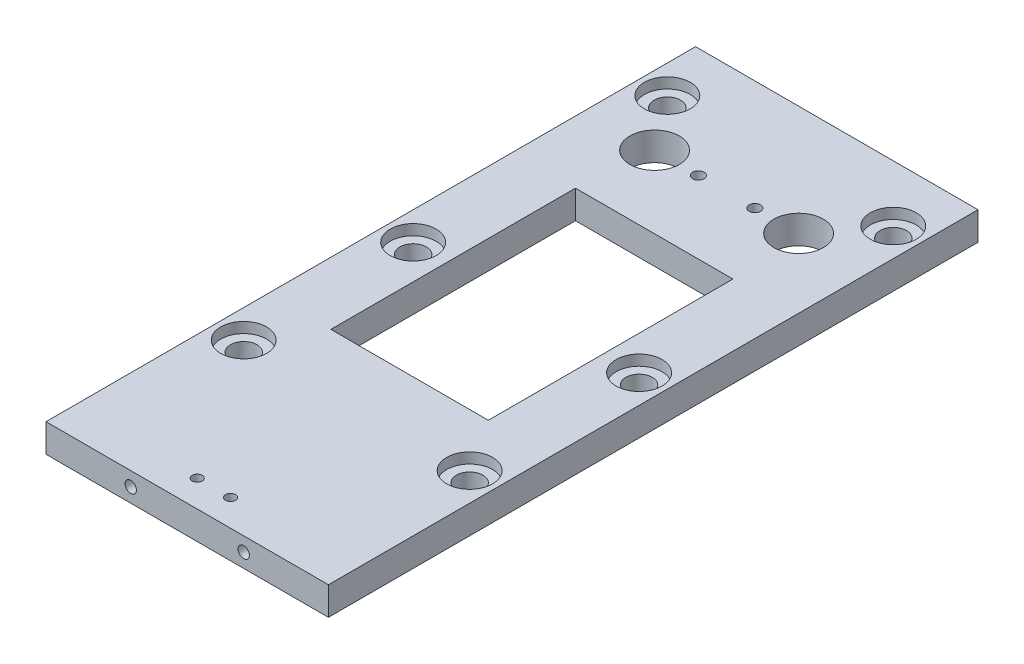
ISO-10303-21;
HEADER;
FILE_DESCRIPTION(('STEP AP214'),'2;1');
FILE_NAME('part.step','',(''),(''),'','','');
FILE_SCHEMA(('AUTOMOTIVE_DESIGN { 1 0 10303 214 1 1 1 1 }'));
ENDSEC;
DATA;
#1=APPLICATION_CONTEXT('core data for automotive mechanical design processes');
#2=APPLICATION_PROTOCOL_DEFINITION('international standard','automotive_design',2000,#1);
#3=PRODUCT_CONTEXT('',#1,'mechanical');
#4=PRODUCT('Part','Part','',(#3));
#5=PRODUCT_RELATED_PRODUCT_CATEGORY('part','',(#4));
#6=PRODUCT_DEFINITION_FORMATION('','',#4);
#7=PRODUCT_DEFINITION_CONTEXT('part definition',#1,'design');
#8=PRODUCT_DEFINITION('design','',#6,#7);
#9=PRODUCT_DEFINITION_SHAPE('','',#8);
#10=(LENGTH_UNIT() NAMED_UNIT(*) SI_UNIT(.MILLI.,.METRE.));
#11=(NAMED_UNIT(*) PLANE_ANGLE_UNIT() SI_UNIT($,.RADIAN.));
#12=(NAMED_UNIT(*) SI_UNIT($,.STERADIAN.) SOLID_ANGLE_UNIT());
#13=UNCERTAINTY_MEASURE_WITH_UNIT(LENGTH_MEASURE(1.E-05),#10,'distance_accuracy_value','');
#14=(GEOMETRIC_REPRESENTATION_CONTEXT(3) GLOBAL_UNCERTAINTY_ASSIGNED_CONTEXT((#13)) GLOBAL_UNIT_ASSIGNED_CONTEXT((#10,
#11,#12)) REPRESENTATION_CONTEXT('',''));
#15=CARTESIAN_POINT('',(0.,0.,0.));
#16=DIRECTION('',(0.,0.,1.));
#17=DIRECTION('',(1.,0.,0.));
#18=AXIS2_PLACEMENT_3D('',#15,#16,#17);
#19=CARTESIAN_POINT('',(0.,12.7,0.));
#20=DIRECTION('',(0.,-1.,0.));
#21=DIRECTION('',(0.,0.,-1.));
#22=AXIS2_PLACEMENT_3D('',#19,#20,#21);
#23=PLANE('',#22);
#24=CARTESIAN_POINT('',(50.8,12.7,3.79999999999998));
#25=DIRECTION('',(0.,1.,0.));
#26=DIRECTION('',(0.,0.,1.));
#27=AXIS2_PLACEMENT_3D('',#24,#25,#26);
#28=CIRCLE('',#27,10.3251);
#29=CARTESIAN_POINT('',(50.8,12.7,14.1251));
#30=VERTEX_POINT('',#29);
#31=EDGE_CURVE('E374',#30,#30,#28,.T.);
#32=ORIENTED_EDGE('',*,*,#31,.F.);
#33=EDGE_LOOP('',(#32));
#34=FACE_BOUND('',#33,.T.);
#35=CARTESIAN_POINT('',(50.8,12.7,-72.4));
#36=DIRECTION('',(0.,1.,0.));
#37=DIRECTION('',(0.,0.,1.));
#38=AXIS2_PLACEMENT_3D('',#35,#36,#37);
#39=CIRCLE('',#38,10.3251);
#40=CARTESIAN_POINT('',(50.8,12.7,-62.0749));
#41=VERTEX_POINT('',#40);
#42=EDGE_CURVE('E406',#41,#41,#39,.T.);
#43=ORIENTED_EDGE('',*,*,#42,.F.);
#44=EDGE_LOOP('',(#43));
#45=FACE_BOUND('',#44,.T.);
#46=CARTESIAN_POINT('',(50.8,12.7,-186.7));
#47=DIRECTION('',(0.,1.,0.));
#48=DIRECTION('',(0.,0.,1.));
#49=AXIS2_PLACEMENT_3D('',#46,#47,#48);
#50=CIRCLE('',#49,10.3251);
#51=CARTESIAN_POINT('',(50.8,12.7,-176.3749));
#52=VERTEX_POINT('',#51);
#53=EDGE_CURVE('E390',#52,#52,#50,.T.);
#54=ORIENTED_EDGE('',*,*,#53,.F.);
#55=EDGE_LOOP('',(#54));
#56=FACE_BOUND('',#55,.T.);
#57=CARTESIAN_POINT('',(-50.8,12.7000000000003,3.80000000000001));
#58=DIRECTION('',(0.,1.,0.));
#59=DIRECTION('',(0.,0.,1.));
#60=AXIS2_PLACEMENT_3D('',#57,#58,#59);
#61=CIRCLE('',#60,10.3251);
#62=CARTESIAN_POINT('',(-50.8,12.7000000000003,14.1251));
#63=VERTEX_POINT('',#62);
#64=EDGE_CURVE('E316',#63,#63,#61,.T.);
#65=ORIENTED_EDGE('',*,*,#64,.F.);
#66=EDGE_LOOP('',(#65));
#67=FACE_BOUND('',#66,.T.);
#68=CARTESIAN_POINT('',(-50.8,12.7000000000003,-72.4));
#69=DIRECTION('',(0.,1.,0.));
#70=DIRECTION('',(0.,0.,1.));
#71=AXIS2_PLACEMENT_3D('',#68,#69,#70);
#72=CIRCLE('',#71,10.3251);
#73=CARTESIAN_POINT('',(-50.8,12.7000000000003,-62.0749));
#74=VERTEX_POINT('',#73);
#75=EDGE_CURVE('E348',#74,#74,#72,.T.);
#76=ORIENTED_EDGE('',*,*,#75,.F.);
#77=EDGE_LOOP('',(#76));
#78=FACE_BOUND('',#77,.T.);
#79=CARTESIAN_POINT('',(-50.8000000000001,12.7000000000003,-186.7));
#80=DIRECTION('',(0.,1.,0.));
#81=DIRECTION('',(0.,0.,1.));
#82=AXIS2_PLACEMENT_3D('',#79,#80,#81);
#83=CIRCLE('',#82,10.3251);
#84=CARTESIAN_POINT('',(-50.8000000000001,12.7000000000003,-176.3749));
#85=VERTEX_POINT('',#84);
#86=EDGE_CURVE('E332',#85,#85,#83,.T.);
#87=ORIENTED_EDGE('',*,*,#86,.F.);
#88=EDGE_LOOP('',(#87));
#89=FACE_BOUND('',#88,.T.);
#90=DIRECTION('',(0.,0.,1.));
#91=VECTOR('',#90,1.);
#92=CARTESIAN_POINT('',(-63.4999999999999,12.7000000000003,80.));
#93=LINE('',#92,#91);
#94=CARTESIAN_POINT('',(-63.5000000000001,12.7000000000003,-212.1));
#95=VERTEX_POINT('',#94);
#96=CARTESIAN_POINT('',(-63.4999999999999,12.7000000000003,80.));
#97=VERTEX_POINT('',#96);
#98=EDGE_CURVE('E364',#95,#97,#93,.T.);
#99=ORIENTED_EDGE('',*,*,#98,.T.);
#100=DIRECTION('',(-1.,0.,0.));
#101=VECTOR('',#100,1.);
#102=CARTESIAN_POINT('',(25.4,12.7,80.));
#103=LINE('',#102,#101);
#104=CARTESIAN_POINT('',(63.5,12.7,80.));
#105=VERTEX_POINT('',#104);
#106=EDGE_CURVE('E165',#105,#97,#103,.T.);
#107=ORIENTED_EDGE('',*,*,#106,.F.);
#108=DIRECTION('',(0.,0.,1.));
#109=VECTOR('',#108,1.);
#110=CARTESIAN_POINT('',(63.5,12.7,80.));
#111=LINE('',#110,#109);
#112=CARTESIAN_POINT('',(63.5,12.7,-212.1));
#113=VERTEX_POINT('',#112);
#114=EDGE_CURVE('E159',#113,#105,#111,.T.);
#115=ORIENTED_EDGE('',*,*,#114,.F.);
#116=DIRECTION('',(1.,0.,0.));
#117=VECTOR('',#116,1.);
#118=CARTESIAN_POINT('',(-63.5000000000001,12.7000000000003,-212.1));
#119=LINE('',#118,#117);
#120=EDGE_CURVE('E137',#95,#113,#119,.T.);
#121=ORIENTED_EDGE('',*,*,#120,.F.);
#122=EDGE_LOOP('',(#99,#107,#115,#121));
#123=FACE_BOUND('',#122,.T.);
#124=DIRECTION('',(1.,0.,0.));
#125=VECTOR('',#124,1.);
#126=CARTESIAN_POINT('',(35.4,12.7,-20.));
#127=LINE('',#126,#125);
#128=CARTESIAN_POINT('',(-35.4,12.7,-20.));
#129=VERTEX_POINT('',#128);
#130=CARTESIAN_POINT('',(35.4,12.7,-20.));
#131=VERTEX_POINT('',#130);
#132=EDGE_CURVE('E258',#129,#131,#127,.T.);
#133=ORIENTED_EDGE('',*,*,#132,.F.);
#134=DIRECTION('',(0.,0.,1.));
#135=VECTOR('',#134,1.);
#136=CARTESIAN_POINT('',(-35.4,12.7,-130.));
#137=LINE('',#136,#135);
#138=CARTESIAN_POINT('',(-35.4,12.7,-130.));
#139=VERTEX_POINT('',#138);
#140=EDGE_CURVE('E262',#139,#129,#137,.T.);
#141=ORIENTED_EDGE('',*,*,#140,.F.);
#142=DIRECTION('',(-1.,0.,0.));
#143=VECTOR('',#142,1.);
#144=CARTESIAN_POINT('',(35.4,12.7,-130.));
#145=LINE('',#144,#143);
#146=CARTESIAN_POINT('',(35.4,12.7,-130.));
#147=VERTEX_POINT('',#146);
#148=EDGE_CURVE('E266',#147,#139,#145,.T.);
#149=ORIENTED_EDGE('',*,*,#148,.F.);
#150=DIRECTION('',(0.,0.,-1.));
#151=VECTOR('',#150,1.);
#152=CARTESIAN_POINT('',(35.4,12.7,-130.));
#153=LINE('',#152,#151);
#154=EDGE_CURVE('E257',#131,#147,#153,.T.);
#155=ORIENTED_EDGE('',*,*,#154,.F.);
#156=EDGE_LOOP('',(#133,#141,#149,#155));
#157=FACE_BOUND('',#156,.T.);
#158=CARTESIAN_POINT('',(-7.49999999999998,12.7000000000001,68.));
#159=DIRECTION('',(0.,-1.,0.));
#160=DIRECTION('',(0.,0.,-1.));
#161=AXIS2_PLACEMENT_3D('',#158,#159,#160);
#162=CIRCLE('',#161,2.25);
#163=CARTESIAN_POINT('',(-7.49999999999998,12.7000000000001,65.75));
#164=VERTEX_POINT('',#163);
#165=EDGE_CURVE('E201',#164,#164,#162,.F.);
#166=ORIENTED_EDGE('',*,*,#165,.F.);
#167=EDGE_LOOP('',(#166));
#168=FACE_BOUND('',#167,.T.);
#169=CARTESIAN_POINT('',(7.50000000000002,12.7000000000001,68.));
#170=DIRECTION('',(0.,-1.,0.));
#171=DIRECTION('',(0.,0.,-1.));
#172=AXIS2_PLACEMENT_3D('',#169,#170,#171);
#173=CIRCLE('',#172,2.25);
#174=CARTESIAN_POINT('',(7.50000000000002,12.7000000000001,65.75));
#175=VERTEX_POINT('',#174);
#176=EDGE_CURVE('E205',#175,#175,#173,.F.);
#177=ORIENTED_EDGE('',*,*,#176,.F.);
#178=EDGE_LOOP('',(#177));
#179=FACE_BOUND('',#178,.T.);
#180=CARTESIAN_POINT('',(32.385,12.7,-162.55));
#181=DIRECTION('',(0.,-1.,0.));
#182=DIRECTION('',(1.,0.,0.));
#183=AXIS2_PLACEMENT_3D('',#180,#181,#182);
#184=CIRCLE('',#183,11.1125);
#185=CARTESIAN_POINT('',(43.4975,12.7,-162.55));
#186=VERTEX_POINT('',#185);
#187=EDGE_CURVE('E72',#186,#186,#184,.F.);
#188=ORIENTED_EDGE('',*,*,#187,.F.);
#189=EDGE_LOOP('',(#188));
#190=FACE_BOUND('',#189,.T.);
#191=CARTESIAN_POINT('',(-32.385,12.7000000000002,-162.55));
#192=DIRECTION('',(0.,-1.,0.));
#193=DIRECTION('',(1.,0.,0.));
#194=AXIS2_PLACEMENT_3D('',#191,#192,#193);
#195=CIRCLE('',#194,11.1125);
#196=CARTESIAN_POINT('',(-21.2725,12.7000000000002,-162.55));
#197=VERTEX_POINT('',#196);
#198=EDGE_CURVE('E13',#197,#197,#195,.F.);
#199=ORIENTED_EDGE('',*,*,#198,.F.);
#200=EDGE_LOOP('',(#199));
#201=FACE_BOUND('',#200,.T.);
#202=CARTESIAN_POINT('',(12.7,12.7,-162.55));
#203=DIRECTION('',(0.,1.,0.));
#204=DIRECTION('',(0.,0.,1.));
#205=AXIS2_PLACEMENT_3D('',#202,#203,#204);
#206=CIRCLE('',#205,2.55269999999996);
#207=CARTESIAN_POINT('',(12.7,12.7,-159.9973));
#208=VERTEX_POINT('',#207);
#209=EDGE_CURVE('E227',#208,#208,#206,.T.);
#210=ORIENTED_EDGE('',*,*,#209,.F.);
#211=EDGE_LOOP('',(#210));
#212=FACE_BOUND('',#211,.T.);
#213=CARTESIAN_POINT('',(-12.7,12.7,-162.55));
#214=DIRECTION('',(0.,1.,0.));
#215=DIRECTION('',(0.,0.,1.));
#216=AXIS2_PLACEMENT_3D('',#213,#214,#215);
#217=CIRCLE('',#216,2.55269999999996);
#218=CARTESIAN_POINT('',(-12.7,12.7,-159.9973));
#219=VERTEX_POINT('',#218);
#220=EDGE_CURVE('E230',#219,#219,#217,.T.);
#221=ORIENTED_EDGE('',*,*,#220,.F.);
#222=EDGE_LOOP('',(#221));
#223=FACE_BOUND('',#222,.T.);
#224=ADVANCED_FACE('F63',(#34,#45,#56,#67,#78,#89,#123,#157,#168,#179,#190,#201,#212,#223),#23,.F.);
#225=CARTESIAN_POINT('',(7.50000000000002,0.,68.));
#226=DIRECTION('',(0.,-1.,0.));
#227=DIRECTION('',(0.,0.,-1.));
#228=AXIS2_PLACEMENT_3D('',#225,#226,#227);
#229=CYLINDRICAL_SURFACE('',#228,4.);
#230=CARTESIAN_POINT('',(7.50000000000002,4.,68.));
#231=DIRECTION('',(0.,-1.,0.));
#232=DIRECTION('',(0.,0.,-1.));
#233=AXIS2_PLACEMENT_3D('',#230,#231,#232);
#234=CIRCLE('',#233,4.);
#235=CARTESIAN_POINT('',(7.50000000000002,4.,64.));
#236=VERTEX_POINT('',#235);
#237=EDGE_CURVE('E190',#236,#236,#234,.T.);
#238=ORIENTED_EDGE('',*,*,#237,.F.);
#239=EDGE_LOOP('',(#238));
#240=FACE_BOUND('',#239,.T.);
#241=CARTESIAN_POINT('',(7.50000000000002,0.,68.));
#242=DIRECTION('',(0.,-1.,0.));
#243=DIRECTION('',(0.,0.,-1.));
#244=AXIS2_PLACEMENT_3D('',#241,#242,#243);
#245=CIRCLE('',#244,4.);
#246=CARTESIAN_POINT('',(7.50000000000002,0.,64.));
#247=VERTEX_POINT('',#246);
#248=EDGE_CURVE('E186',#247,#247,#245,.T.);
#249=ORIENTED_EDGE('',*,*,#248,.T.);
#250=EDGE_LOOP('',(#249));
#251=FACE_BOUND('',#250,.T.);
#252=ADVANCED_FACE('F218',(#240,#251),#229,.F.);
#253=CARTESIAN_POINT('',(9.75000000000002,4.,68.));
#254=DIRECTION('',(0.,1.,0.));
#255=DIRECTION('',(0.,0.,1.));
#256=AXIS2_PLACEMENT_3D('',#253,#254,#255);
#257=PLANE('',#256);
#258=CARTESIAN_POINT('',(7.50000000000002,4.,68.));
#259=DIRECTION('',(0.,-1.,0.));
#260=DIRECTION('',(0.,0.,-1.));
#261=AXIS2_PLACEMENT_3D('',#258,#259,#260);
#262=CIRCLE('',#261,2.25);
#263=CARTESIAN_POINT('',(7.50000000000002,4.,65.75));
#264=VERTEX_POINT('',#263);
#265=EDGE_CURVE('E194',#264,#264,#262,.T.);
#266=ORIENTED_EDGE('',*,*,#265,.F.);
#267=EDGE_LOOP('',(#266));
#268=FACE_BOUND('',#267,.T.);
#269=ORIENTED_EDGE('',*,*,#237,.T.);
#270=EDGE_LOOP('',(#269));
#271=FACE_BOUND('',#270,.T.);
#272=ADVANCED_FACE('F462',(#268,#271),#257,.F.);
#273=CARTESIAN_POINT('',(7.50000000000002,0.,68.));
#274=DIRECTION('',(0.,-1.,0.));
#275=DIRECTION('',(0.,0.,-1.));
#276=AXIS2_PLACEMENT_3D('',#273,#274,#275);
#277=CYLINDRICAL_SURFACE('',#276,2.25);
#278=ORIENTED_EDGE('',*,*,#176,.T.);
#279=EDGE_LOOP('',(#278));
#280=FACE_BOUND('',#279,.T.);
#281=ORIENTED_EDGE('',*,*,#265,.T.);
#282=EDGE_LOOP('',(#281));
#283=FACE_BOUND('',#282,.T.);
#284=ADVANCED_FACE('F458',(#280,#283),#277,.F.);
#285=CARTESIAN_POINT('',(-7.49999999999998,0.,68.));
#286=DIRECTION('',(0.,-1.,0.));
#287=DIRECTION('',(0.,0.,-1.));
#288=AXIS2_PLACEMENT_3D('',#285,#286,#287);
#289=CYLINDRICAL_SURFACE('',#288,4.);
#290=CARTESIAN_POINT('',(-7.49999999999998,4.,68.));
#291=DIRECTION('',(0.,-1.,0.));
#292=DIRECTION('',(0.,0.,-1.));
#293=AXIS2_PLACEMENT_3D('',#290,#291,#292);
#294=CIRCLE('',#293,4.);
#295=CARTESIAN_POINT('',(-7.49999999999998,4.,64.));
#296=VERTEX_POINT('',#295);
#297=EDGE_CURVE('E178',#296,#296,#294,.T.);
#298=ORIENTED_EDGE('',*,*,#297,.F.);
#299=EDGE_LOOP('',(#298));
#300=FACE_BOUND('',#299,.T.);
#301=CARTESIAN_POINT('',(-7.49999999999998,0.,68.));
#302=DIRECTION('',(0.,-1.,0.));
#303=DIRECTION('',(0.,0.,-1.));
#304=AXIS2_PLACEMENT_3D('',#301,#302,#303);
#305=CIRCLE('',#304,4.);
#306=CARTESIAN_POINT('',(-7.49999999999998,0.,64.));
#307=VERTEX_POINT('',#306);
#308=EDGE_CURVE('E174',#307,#307,#305,.T.);
#309=ORIENTED_EDGE('',*,*,#308,.T.);
#310=EDGE_LOOP('',(#309));
#311=FACE_BOUND('',#310,.T.);
#312=ADVANCED_FACE('F461',(#300,#311),#289,.F.);
#313=CARTESIAN_POINT('',(-5.24999999999998,4.,68.));
#314=DIRECTION('',(0.,1.,0.));
#315=DIRECTION('',(0.,0.,1.));
#316=AXIS2_PLACEMENT_3D('',#313,#314,#315);
#317=PLANE('',#316);
#318=CARTESIAN_POINT('',(-7.49999999999998,4.,68.));
#319=DIRECTION('',(0.,-1.,0.));
#320=DIRECTION('',(0.,0.,-1.));
#321=AXIS2_PLACEMENT_3D('',#318,#319,#320);
#322=CIRCLE('',#321,2.25);
#323=CARTESIAN_POINT('',(-7.49999999999998,4.,65.75));
#324=VERTEX_POINT('',#323);
#325=EDGE_CURVE('E182',#324,#324,#322,.T.);
#326=ORIENTED_EDGE('',*,*,#325,.F.);
#327=EDGE_LOOP('',(#326));
#328=FACE_BOUND('',#327,.T.);
#329=ORIENTED_EDGE('',*,*,#297,.T.);
#330=EDGE_LOOP('',(#329));
#331=FACE_BOUND('',#330,.T.);
#332=ADVANCED_FACE('F495',(#328,#331),#317,.F.);
#333=CARTESIAN_POINT('',(-7.49999999999998,0.,68.));
#334=DIRECTION('',(0.,-1.,0.));
#335=DIRECTION('',(0.,0.,-1.));
#336=AXIS2_PLACEMENT_3D('',#333,#334,#335);
#337=CYLINDRICAL_SURFACE('',#336,2.25);
#338=ORIENTED_EDGE('',*,*,#165,.T.);
#339=EDGE_LOOP('',(#338));
#340=FACE_BOUND('',#339,.T.);
#341=ORIENTED_EDGE('',*,*,#325,.T.);
#342=EDGE_LOOP('',(#341));
#343=FACE_BOUND('',#342,.T.);
#344=ADVANCED_FACE('F492',(#340,#343),#337,.F.);
#345=CARTESIAN_POINT('',(50.8,12.7,-72.4));
#346=DIRECTION('',(0.,1.,0.));
#347=DIRECTION('',(0.,0.,1.));
#348=AXIS2_PLACEMENT_3D('',#345,#346,#347);
#349=CYLINDRICAL_SURFACE('',#348,5.953125);
#350=CARTESIAN_POINT('',(50.8,7.9502,-72.4));
#351=DIRECTION('',(0.,1.,0.));
#352=DIRECTION('',(0.,0.,1.));
#353=AXIS2_PLACEMENT_3D('',#350,#351,#352);
#354=CIRCLE('',#353,5.953125);
#355=CARTESIAN_POINT('',(50.8,7.9502,-66.446875));
#356=VERTEX_POINT('',#355);
#357=EDGE_CURVE('E168',#356,#356,#354,.T.);
#358=ORIENTED_EDGE('',*,*,#357,.T.);
#359=EDGE_LOOP('',(#358));
#360=FACE_BOUND('',#359,.T.);
#361=CARTESIAN_POINT('',(50.8,0.,-72.4));
#362=DIRECTION('',(0.,-1.,0.));
#363=DIRECTION('',(0.,0.,-1.));
#364=AXIS2_PLACEMENT_3D('',#361,#362,#363);
#365=CIRCLE('',#364,5.953125);
#366=CARTESIAN_POINT('',(50.8,0.,-78.353125));
#367=VERTEX_POINT('',#366);
#368=EDGE_CURVE('E160',#367,#367,#365,.T.);
#369=ORIENTED_EDGE('',*,*,#368,.T.);
#370=EDGE_LOOP('',(#369));
#371=FACE_BOUND('',#370,.T.);
#372=ADVANCED_FACE('F419',(#360,#371),#349,.F.);
#373=CARTESIAN_POINT('',(50.8,12.7,-186.7));
#374=DIRECTION('',(0.,1.,0.));
#375=DIRECTION('',(0.,0.,1.));
#376=AXIS2_PLACEMENT_3D('',#373,#374,#375);
#377=CYLINDRICAL_SURFACE('',#376,5.953125);
#378=CARTESIAN_POINT('',(50.8,7.9502,-186.7));
#379=DIRECTION('',(0.,1.,0.));
#380=DIRECTION('',(0.,0.,1.));
#381=AXIS2_PLACEMENT_3D('',#378,#379,#380);
#382=CIRCLE('',#381,5.953125);
#383=CARTESIAN_POINT('',(50.8,7.9502,-180.746875));
#384=VERTEX_POINT('',#383);
#385=EDGE_CURVE('E398',#384,#384,#382,.T.);
#386=ORIENTED_EDGE('',*,*,#385,.T.);
#387=EDGE_LOOP('',(#386));
#388=FACE_BOUND('',#387,.T.);
#389=CARTESIAN_POINT('',(50.8,0.,-186.7));
#390=DIRECTION('',(0.,-1.,0.));
#391=DIRECTION('',(0.,0.,-1.));
#392=AXIS2_PLACEMENT_3D('',#389,#390,#391);
#393=CIRCLE('',#392,5.953125);
#394=CARTESIAN_POINT('',(50.8,0.,-192.653125));
#395=VERTEX_POINT('',#394);
#396=EDGE_CURVE('E402',#395,#395,#393,.T.);
#397=ORIENTED_EDGE('',*,*,#396,.T.);
#398=EDGE_LOOP('',(#397));
#399=FACE_BOUND('',#398,.T.);
#400=ADVANCED_FACE('F509',(#388,#399),#377,.F.);
#401=CARTESIAN_POINT('',(50.8,12.7,3.79999999999998));
#402=DIRECTION('',(0.,1.,0.));
#403=DIRECTION('',(0.,0.,1.));
#404=AXIS2_PLACEMENT_3D('',#401,#402,#403);
#405=CYLINDRICAL_SURFACE('',#404,5.953125);
#406=CARTESIAN_POINT('',(50.8,7.9502,3.79999999999998));
#407=DIRECTION('',(0.,1.,0.));
#408=DIRECTION('',(0.,0.,1.));
#409=AXIS2_PLACEMENT_3D('',#406,#407,#408);
#410=CIRCLE('',#409,5.953125);
#411=CARTESIAN_POINT('',(50.8,7.9502,9.75312499999999));
#412=VERTEX_POINT('',#411);
#413=EDGE_CURVE('E382',#412,#412,#410,.T.);
#414=ORIENTED_EDGE('',*,*,#413,.T.);
#415=EDGE_LOOP('',(#414));
#416=FACE_BOUND('',#415,.T.);
#417=CARTESIAN_POINT('',(50.8,0.,3.79999999999998));
#418=DIRECTION('',(0.,-1.,0.));
#419=DIRECTION('',(0.,0.,-1.));
#420=AXIS2_PLACEMENT_3D('',#417,#418,#419);
#421=CIRCLE('',#420,5.953125);
#422=CARTESIAN_POINT('',(50.8,0.,-2.15312500000002));
#423=VERTEX_POINT('',#422);
#424=EDGE_CURVE('E386',#423,#423,#421,.T.);
#425=ORIENTED_EDGE('',*,*,#424,.T.);
#426=EDGE_LOOP('',(#425));
#427=FACE_BOUND('',#426,.T.);
#428=ADVANCED_FACE('F513',(#416,#427),#405,.F.);
#429=CARTESIAN_POINT('',(-50.8,12.7000000000003,-72.4));
#430=DIRECTION('',(0.,1.,0.));
#431=DIRECTION('',(0.,0.,1.));
#432=AXIS2_PLACEMENT_3D('',#429,#430,#431);
#433=CYLINDRICAL_SURFACE('',#432,5.953125);
#434=CARTESIAN_POINT('',(-50.8,7.95020000000025,-72.4));
#435=DIRECTION('',(0.,1.,0.));
#436=DIRECTION('',(0.,0.,1.));
#437=AXIS2_PLACEMENT_3D('',#434,#435,#436);
#438=CIRCLE('',#437,5.953125);
#439=CARTESIAN_POINT('',(-50.8,7.95020000000025,-66.446875));
#440=VERTEX_POINT('',#439);
#441=EDGE_CURVE('E356',#440,#440,#438,.T.);
#442=ORIENTED_EDGE('',*,*,#441,.T.);
#443=EDGE_LOOP('',(#442));
#444=FACE_BOUND('',#443,.T.);
#445=CARTESIAN_POINT('',(-50.8,0.,-72.4));
#446=DIRECTION('',(0.,-1.,0.));
#447=DIRECTION('',(0.,0.,-1.));
#448=AXIS2_PLACEMENT_3D('',#445,#446,#447);
#449=CIRCLE('',#448,5.953125);
#450=CARTESIAN_POINT('',(-50.8,0.,-78.353125));
#451=VERTEX_POINT('',#450);
#452=EDGE_CURVE('E360',#451,#451,#449,.T.);
#453=ORIENTED_EDGE('',*,*,#452,.T.);
#454=EDGE_LOOP('',(#453));
#455=FACE_BOUND('',#454,.T.);
#456=ADVANCED_FACE('F525',(#444,#455),#433,.F.);
#457=CARTESIAN_POINT('',(-50.8000000000001,12.7000000000003,-186.7));
#458=DIRECTION('',(0.,1.,0.));
#459=DIRECTION('',(0.,0.,1.));
#460=AXIS2_PLACEMENT_3D('',#457,#458,#459);
#461=CYLINDRICAL_SURFACE('',#460,5.953125);
#462=CARTESIAN_POINT('',(-50.8000000000001,7.95020000000025,-186.7));
#463=DIRECTION('',(0.,1.,0.));
#464=DIRECTION('',(0.,0.,1.));
#465=AXIS2_PLACEMENT_3D('',#462,#463,#464);
#466=CIRCLE('',#465,5.953125);
#467=CARTESIAN_POINT('',(-50.8000000000001,7.95020000000025,-180.746875));
#468=VERTEX_POINT('',#467);
#469=EDGE_CURVE('E340',#468,#468,#466,.T.);
#470=ORIENTED_EDGE('',*,*,#469,.T.);
#471=EDGE_LOOP('',(#470));
#472=FACE_BOUND('',#471,.T.);
#473=CARTESIAN_POINT('',(-50.8000000000001,0.,-186.7));
#474=DIRECTION('',(0.,-1.,0.));
#475=DIRECTION('',(0.,0.,-1.));
#476=AXIS2_PLACEMENT_3D('',#473,#474,#475);
#477=CIRCLE('',#476,5.953125);
#478=CARTESIAN_POINT('',(-50.8000000000001,0.,-192.653125));
#479=VERTEX_POINT('',#478);
#480=EDGE_CURVE('E344',#479,#479,#477,.T.);
#481=ORIENTED_EDGE('',*,*,#480,.T.);
#482=EDGE_LOOP('',(#481));
#483=FACE_BOUND('',#482,.T.);
#484=ADVANCED_FACE('F537',(#472,#483),#461,.F.);
#485=CARTESIAN_POINT('',(-50.8,12.7000000000003,3.80000000000001));
#486=DIRECTION('',(0.,1.,0.));
#487=DIRECTION('',(0.,0.,1.));
#488=AXIS2_PLACEMENT_3D('',#485,#486,#487);
#489=CYLINDRICAL_SURFACE('',#488,5.953125);
#490=CARTESIAN_POINT('',(-50.8,7.95020000000025,3.80000000000001));
#491=DIRECTION('',(0.,1.,0.));
#492=DIRECTION('',(0.,0.,1.));
#493=AXIS2_PLACEMENT_3D('',#490,#491,#492);
#494=CIRCLE('',#493,5.953125);
#495=CARTESIAN_POINT('',(-50.8,7.95020000000025,9.75312500000001));
#496=VERTEX_POINT('',#495);
#497=EDGE_CURVE('E324',#496,#496,#494,.T.);
#498=ORIENTED_EDGE('',*,*,#497,.T.);
#499=EDGE_LOOP('',(#498));
#500=FACE_BOUND('',#499,.T.);
#501=CARTESIAN_POINT('',(-50.8,0.,3.80000000000001));
#502=DIRECTION('',(0.,-1.,0.));
#503=DIRECTION('',(0.,0.,-1.));
#504=AXIS2_PLACEMENT_3D('',#501,#502,#503);
#505=CIRCLE('',#504,5.953125);
#506=CARTESIAN_POINT('',(-50.8,0.,-2.15312499999999));
#507=VERTEX_POINT('',#506);
#508=EDGE_CURVE('E328',#507,#507,#505,.T.);
#509=ORIENTED_EDGE('',*,*,#508,.T.);
#510=EDGE_LOOP('',(#509));
#511=FACE_BOUND('',#510,.T.);
#512=ADVANCED_FACE('F550',(#500,#511),#489,.F.);
#513=CARTESIAN_POINT('',(-25.4,6.35000000000008,67.3));
#514=DIRECTION('',(0.,0.,1.));
#515=DIRECTION('',(1.,0.,0.));
#516=AXIS2_PLACEMENT_3D('',#513,#514,#515);
#517=CONICAL_SURFACE('',#516,2.5527,1.02974425867665);
#518=CARTESIAN_POINT('',(-25.4,6.35000000000008,65.7661830978083));
#519=VERTEX_POINT('',#518);
#520=VERTEX_LOOP('',#519);
#521=FACE_BOUND('',#520,.T.);
#522=CARTESIAN_POINT('',(-25.4,6.35000000000008,67.3));
#523=DIRECTION('',(0.,0.,1.));
#524=DIRECTION('',(1.,0.,0.));
#525=AXIS2_PLACEMENT_3D('',#522,#523,#524);
#526=CIRCLE('',#525,2.5527);
#527=CARTESIAN_POINT('',(-22.8473,6.35000000000008,67.3));
#528=VERTEX_POINT('',#527);
#529=EDGE_CURVE('E312',#528,#528,#526,.T.);
#530=ORIENTED_EDGE('',*,*,#529,.T.);
#531=EDGE_LOOP('',(#530));
#532=FACE_BOUND('',#531,.T.);
#533=ADVANCED_FACE('F559',(#521,#532),#517,.F.);
#534=CARTESIAN_POINT('',(25.4,6.34999999999996,67.3));
#535=DIRECTION('',(0.,0.,1.));
#536=DIRECTION('',(1.,0.,0.));
#537=AXIS2_PLACEMENT_3D('',#534,#535,#536);
#538=CONICAL_SURFACE('',#537,2.5527,1.02974425867665);
#539=CARTESIAN_POINT('',(25.4,6.34999999999996,65.7661830978083));
#540=VERTEX_POINT('',#539);
#541=VERTEX_LOOP('',#540);
#542=FACE_BOUND('',#541,.T.);
#543=CARTESIAN_POINT('',(25.4,6.34999999999996,67.3));
#544=DIRECTION('',(0.,0.,1.));
#545=DIRECTION('',(1.,0.,0.));
#546=AXIS2_PLACEMENT_3D('',#543,#544,#545);
#547=CIRCLE('',#546,2.5527);
#548=CARTESIAN_POINT('',(27.9527,6.34999999999996,67.3));
#549=VERTEX_POINT('',#548);
#550=EDGE_CURVE('E304',#549,#549,#547,.T.);
#551=ORIENTED_EDGE('',*,*,#550,.T.);
#552=EDGE_LOOP('',(#551));
#553=FACE_BOUND('',#552,.T.);
#554=ADVANCED_FACE('F541',(#542,#553),#538,.F.);
#555=CARTESIAN_POINT('',(-44.846875,7.95020000000025,-72.4));
#556=DIRECTION('',(0.,-1.,0.));
#557=DIRECTION('',(0.,0.,-1.));
#558=AXIS2_PLACEMENT_3D('',#555,#556,#557);
#559=PLANE('',#558);
#560=ORIENTED_EDGE('',*,*,#441,.F.);
#561=EDGE_LOOP('',(#560));
#562=FACE_BOUND('',#561,.T.);
#563=CARTESIAN_POINT('',(-50.8,7.95020000000025,-72.4));
#564=DIRECTION('',(0.,1.,0.));
#565=DIRECTION('',(0.,0.,1.));
#566=AXIS2_PLACEMENT_3D('',#563,#564,#565);
#567=CIRCLE('',#566,10.3251);
#568=CARTESIAN_POINT('',(-50.8,7.95020000000025,-62.0749));
#569=VERTEX_POINT('',#568);
#570=EDGE_CURVE('E352',#569,#569,#567,.T.);
#571=ORIENTED_EDGE('',*,*,#570,.T.);
#572=EDGE_LOOP('',(#571));
#573=FACE_BOUND('',#572,.T.);
#574=ADVANCED_FACE('F426',(#562,#573),#559,.F.);
#575=CARTESIAN_POINT('',(56.753125,7.9502,-72.4));
#576=DIRECTION('',(0.,-1.,0.));
#577=DIRECTION('',(0.,0.,-1.));
#578=AXIS2_PLACEMENT_3D('',#575,#576,#577);
#579=PLANE('',#578);
#580=ORIENTED_EDGE('',*,*,#357,.F.);
#581=EDGE_LOOP('',(#580));
#582=FACE_BOUND('',#581,.T.);
#583=CARTESIAN_POINT('',(50.8,7.9502,-72.4));
#584=DIRECTION('',(0.,1.,0.));
#585=DIRECTION('',(0.,0.,1.));
#586=AXIS2_PLACEMENT_3D('',#583,#584,#585);
#587=CIRCLE('',#586,10.3251);
#588=CARTESIAN_POINT('',(50.8,7.9502,-62.0749));
#589=VERTEX_POINT('',#588);
#590=EDGE_CURVE('E410',#589,#589,#587,.T.);
#591=ORIENTED_EDGE('',*,*,#590,.T.);
#592=EDGE_LOOP('',(#591));
#593=FACE_BOUND('',#592,.T.);
#594=ADVANCED_FACE('F422',(#582,#593),#579,.F.);
#595=CARTESIAN_POINT('',(56.753125,7.9502,-186.7));
#596=DIRECTION('',(0.,-1.,0.));
#597=DIRECTION('',(0.,0.,-1.));
#598=AXIS2_PLACEMENT_3D('',#595,#596,#597);
#599=PLANE('',#598);
#600=ORIENTED_EDGE('',*,*,#385,.F.);
#601=EDGE_LOOP('',(#600));
#602=FACE_BOUND('',#601,.T.);
#603=CARTESIAN_POINT('',(50.8,7.9502,-186.7));
#604=DIRECTION('',(0.,1.,0.));
#605=DIRECTION('',(0.,0.,1.));
#606=AXIS2_PLACEMENT_3D('',#603,#604,#605);
#607=CIRCLE('',#606,10.3251);
#608=CARTESIAN_POINT('',(50.8,7.9502,-176.3749));
#609=VERTEX_POINT('',#608);
#610=EDGE_CURVE('E394',#609,#609,#607,.T.);
#611=ORIENTED_EDGE('',*,*,#610,.T.);
#612=EDGE_LOOP('',(#611));
#613=FACE_BOUND('',#612,.T.);
#614=ADVANCED_FACE('F425',(#602,#613),#599,.F.);
#615=CARTESIAN_POINT('',(-44.8468750000001,7.95020000000025,-186.7));
#616=DIRECTION('',(0.,-1.,0.));
#617=DIRECTION('',(0.,0.,-1.));
#618=AXIS2_PLACEMENT_3D('',#615,#616,#617);
#619=PLANE('',#618);
#620=ORIENTED_EDGE('',*,*,#469,.F.);
#621=EDGE_LOOP('',(#620));
#622=FACE_BOUND('',#621,.T.);
#623=CARTESIAN_POINT('',(-50.8000000000001,7.95020000000025,-186.7));
#624=DIRECTION('',(0.,1.,0.));
#625=DIRECTION('',(0.,0.,1.));
#626=AXIS2_PLACEMENT_3D('',#623,#624,#625);
#627=CIRCLE('',#626,10.3251);
#628=CARTESIAN_POINT('',(-50.8000000000001,7.95020000000025,-176.3749));
#629=VERTEX_POINT('',#628);
#630=EDGE_CURVE('E336',#629,#629,#627,.T.);
#631=ORIENTED_EDGE('',*,*,#630,.T.);
#632=EDGE_LOOP('',(#631));
#633=FACE_BOUND('',#632,.T.);
#634=ADVANCED_FACE('F517',(#622,#633),#619,.F.);
#635=CARTESIAN_POINT('',(56.753125,7.9502,3.79999999999998));
#636=DIRECTION('',(0.,-1.,0.));
#637=DIRECTION('',(0.,0.,-1.));
#638=AXIS2_PLACEMENT_3D('',#635,#636,#637);
#639=PLANE('',#638);
#640=ORIENTED_EDGE('',*,*,#413,.F.);
#641=EDGE_LOOP('',(#640));
#642=FACE_BOUND('',#641,.T.);
#643=CARTESIAN_POINT('',(50.8,7.9502,3.79999999999998));
#644=DIRECTION('',(0.,1.,0.));
#645=DIRECTION('',(0.,0.,1.));
#646=AXIS2_PLACEMENT_3D('',#643,#644,#645);
#647=CIRCLE('',#646,10.3251);
#648=CARTESIAN_POINT('',(50.8,7.9502,14.1251));
#649=VERTEX_POINT('',#648);
#650=EDGE_CURVE('E378',#649,#649,#647,.T.);
#651=ORIENTED_EDGE('',*,*,#650,.T.);
#652=EDGE_LOOP('',(#651));
#653=FACE_BOUND('',#652,.T.);
#654=ADVANCED_FACE('F527',(#642,#653),#639,.F.);
#655=CARTESIAN_POINT('',(-44.846875,7.95020000000025,3.80000000000001));
#656=DIRECTION('',(0.,-1.,0.));
#657=DIRECTION('',(0.,0.,-1.));
#658=AXIS2_PLACEMENT_3D('',#655,#656,#657);
#659=PLANE('',#658);
#660=ORIENTED_EDGE('',*,*,#497,.F.);
#661=EDGE_LOOP('',(#660));
#662=FACE_BOUND('',#661,.T.);
#663=CARTESIAN_POINT('',(-50.8,7.95020000000025,3.80000000000001));
#664=DIRECTION('',(0.,1.,0.));
#665=DIRECTION('',(0.,0.,1.));
#666=AXIS2_PLACEMENT_3D('',#663,#664,#665);
#667=CIRCLE('',#666,10.3251);
#668=CARTESIAN_POINT('',(-50.8,7.95020000000025,14.1251));
#669=VERTEX_POINT('',#668);
#670=EDGE_CURVE('E320',#669,#669,#667,.T.);
#671=ORIENTED_EDGE('',*,*,#670,.T.);
#672=EDGE_LOOP('',(#671));
#673=FACE_BOUND('',#672,.T.);
#674=ADVANCED_FACE('F530',(#662,#673),#659,.F.);
#675=CARTESIAN_POINT('',(50.8,12.7,3.79999999999998));
#676=DIRECTION('',(0.,1.,0.));
#677=DIRECTION('',(0.,0.,1.));
#678=AXIS2_PLACEMENT_3D('',#675,#676,#677);
#679=CYLINDRICAL_SURFACE('',#678,10.3251);
#680=ORIENTED_EDGE('',*,*,#650,.F.);
#681=EDGE_LOOP('',(#680));
#682=FACE_BOUND('',#681,.T.);
#683=ORIENTED_EDGE('',*,*,#31,.T.);
#684=EDGE_LOOP('',(#683));
#685=FACE_BOUND('',#684,.T.);
#686=ADVANCED_FACE('F434',(#682,#685),#679,.F.);
#687=CARTESIAN_POINT('',(50.8,12.7,-72.4));
#688=DIRECTION('',(0.,1.,0.));
#689=DIRECTION('',(0.,0.,1.));
#690=AXIS2_PLACEMENT_3D('',#687,#688,#689);
#691=CYLINDRICAL_SURFACE('',#690,10.3251);
#692=ORIENTED_EDGE('',*,*,#590,.F.);
#693=EDGE_LOOP('',(#692));
#694=FACE_BOUND('',#693,.T.);
#695=ORIENTED_EDGE('',*,*,#42,.T.);
#696=EDGE_LOOP('',(#695));
#697=FACE_BOUND('',#696,.T.);
#698=ADVANCED_FACE('F430',(#694,#697),#691,.F.);
#699=CARTESIAN_POINT('',(50.8,12.7,-186.7));
#700=DIRECTION('',(0.,1.,0.));
#701=DIRECTION('',(0.,0.,1.));
#702=AXIS2_PLACEMENT_3D('',#699,#700,#701);
#703=CYLINDRICAL_SURFACE('',#702,10.3251);
#704=ORIENTED_EDGE('',*,*,#610,.F.);
#705=EDGE_LOOP('',(#704));
#706=FACE_BOUND('',#705,.T.);
#707=ORIENTED_EDGE('',*,*,#53,.T.);
#708=EDGE_LOOP('',(#707));
#709=FACE_BOUND('',#708,.T.);
#710=ADVANCED_FACE('F433',(#706,#709),#703,.F.);
#711=CARTESIAN_POINT('',(-50.8000000000001,12.7000000000003,-186.7));
#712=DIRECTION('',(0.,1.,0.));
#713=DIRECTION('',(0.,0.,1.));
#714=AXIS2_PLACEMENT_3D('',#711,#712,#713);
#715=CYLINDRICAL_SURFACE('',#714,10.3251);
#716=ORIENTED_EDGE('',*,*,#630,.F.);
#717=EDGE_LOOP('',(#716));
#718=FACE_BOUND('',#717,.T.);
#719=ORIENTED_EDGE('',*,*,#86,.T.);
#720=EDGE_LOOP('',(#719));
#721=FACE_BOUND('',#720,.T.);
#722=ADVANCED_FACE('F521',(#718,#721),#715,.F.);
#723=CARTESIAN_POINT('',(-50.8,12.7000000000003,-72.4));
#724=DIRECTION('',(0.,1.,0.));
#725=DIRECTION('',(0.,0.,1.));
#726=AXIS2_PLACEMENT_3D('',#723,#724,#725);
#727=CYLINDRICAL_SURFACE('',#726,10.3251);
#728=ORIENTED_EDGE('',*,*,#570,.F.);
#729=EDGE_LOOP('',(#728));
#730=FACE_BOUND('',#729,.T.);
#731=ORIENTED_EDGE('',*,*,#75,.T.);
#732=EDGE_LOOP('',(#731));
#733=FACE_BOUND('',#732,.T.);
#734=ADVANCED_FACE('F543',(#730,#733),#727,.F.);
#735=CARTESIAN_POINT('',(-50.8,12.7000000000003,3.80000000000001));
#736=DIRECTION('',(0.,1.,0.));
#737=DIRECTION('',(0.,0.,1.));
#738=AXIS2_PLACEMENT_3D('',#735,#736,#737);
#739=CYLINDRICAL_SURFACE('',#738,10.3251);
#740=ORIENTED_EDGE('',*,*,#670,.F.);
#741=EDGE_LOOP('',(#740));
#742=FACE_BOUND('',#741,.T.);
#743=ORIENTED_EDGE('',*,*,#64,.T.);
#744=EDGE_LOOP('',(#743));
#745=FACE_BOUND('',#744,.T.);
#746=ADVANCED_FACE('F546',(#742,#745),#739,.F.);
#747=CARTESIAN_POINT('',(35.4,-130.815289626251,-130.));
#748=DIRECTION('',(0.,0.,-1.));
#749=DIRECTION('',(-1.,0.,0.));
#750=AXIS2_PLACEMENT_3D('',#747,#748,#749);
#751=PLANE('',#750);
#752=DIRECTION('',(0.,1.,0.));
#753=VECTOR('',#752,1.);
#754=CARTESIAN_POINT('',(35.4,-130.815289626251,-130.));
#755=LINE('',#754,#753);
#756=CARTESIAN_POINT('',(35.4,0.,-130.));
#757=VERTEX_POINT('',#756);
#758=EDGE_CURVE('E88',#757,#147,#755,.T.);
#759=ORIENTED_EDGE('',*,*,#758,.T.);
#760=ORIENTED_EDGE('',*,*,#148,.T.);
#761=DIRECTION('',(0.,1.,0.));
#762=VECTOR('',#761,1.);
#763=CARTESIAN_POINT('',(-35.4,-130.815289626251,-130.));
#764=LINE('',#763,#762);
#765=CARTESIAN_POINT('',(-35.4,0.,-130.));
#766=VERTEX_POINT('',#765);
#767=EDGE_CURVE('E275',#766,#139,#764,.T.);
#768=ORIENTED_EDGE('',*,*,#767,.F.);
#769=DIRECTION('',(-1.,0.,0.));
#770=VECTOR('',#769,1.);
#771=CARTESIAN_POINT('',(35.4,0.,-130.));
#772=LINE('',#771,#770);
#773=EDGE_CURVE('E261',#757,#766,#772,.T.);
#774=ORIENTED_EDGE('',*,*,#773,.F.);
#775=EDGE_LOOP('',(#759,#760,#768,#774));
#776=FACE_BOUND('',#775,.T.);
#777=ADVANCED_FACE('F487',(#776),#751,.F.);
#778=CARTESIAN_POINT('',(63.5,12.7,80.));
#779=DIRECTION('',(1.,0.,0.));
#780=DIRECTION('',(0.,0.,-1.));
#781=AXIS2_PLACEMENT_3D('',#778,#779,#780);
#782=PLANE('',#781);
#783=DIRECTION('',(0.,0.,1.));
#784=VECTOR('',#783,1.);
#785=CARTESIAN_POINT('',(63.5,0.,80.));
#786=LINE('',#785,#784);
#787=CARTESIAN_POINT('',(63.5,0.,-212.1));
#788=VERTEX_POINT('',#787);
#789=CARTESIAN_POINT('',(63.5,0.,80.));
#790=VERTEX_POINT('',#789);
#791=EDGE_CURVE('E148',#788,#790,#786,.T.);
#792=ORIENTED_EDGE('',*,*,#791,.F.);
#793=DIRECTION('',(0.,-1.,0.));
#794=VECTOR('',#793,1.);
#795=CARTESIAN_POINT('',(63.5,12.7,-212.1));
#796=LINE('',#795,#794);
#797=EDGE_CURVE('E134',#113,#788,#796,.T.);
#798=ORIENTED_EDGE('',*,*,#797,.F.);
#799=ORIENTED_EDGE('',*,*,#114,.T.);
#800=DIRECTION('',(0.,-1.,0.));
#801=VECTOR('',#800,1.);
#802=CARTESIAN_POINT('',(63.5,12.7,80.));
#803=LINE('',#802,#801);
#804=EDGE_CURVE('E157',#105,#790,#803,.T.);
#805=ORIENTED_EDGE('',*,*,#804,.T.);
#806=EDGE_LOOP('',(#792,#798,#799,#805));
#807=FACE_BOUND('',#806,.T.);
#808=ADVANCED_FACE('F155',(#807),#782,.T.);
#809=CARTESIAN_POINT('',(0.,0.,0.));
#810=DIRECTION('',(0.,-1.,0.));
#811=DIRECTION('',(0.,0.,-1.));
#812=AXIS2_PLACEMENT_3D('',#809,#810,#811);
#813=PLANE('',#812);
#814=CARTESIAN_POINT('',(-12.7,0.,-162.55));
#815=DIRECTION('',(0.,-1.,0.));
#816=DIRECTION('',(0.,0.,-1.));
#817=AXIS2_PLACEMENT_3D('',#814,#815,#816);
#818=CIRCLE('',#817,2.55269999999998);
#819=CARTESIAN_POINT('',(-12.7,0.,-165.1027));
#820=VERTEX_POINT('',#819);
#821=EDGE_CURVE('E233',#820,#820,#818,.T.);
#822=ORIENTED_EDGE('',*,*,#821,.F.);
#823=EDGE_LOOP('',(#822));
#824=FACE_BOUND('',#823,.T.);
#825=CARTESIAN_POINT('',(12.7,0.,-162.55));
#826=DIRECTION('',(0.,-1.,0.));
#827=DIRECTION('',(0.,0.,-1.));
#828=AXIS2_PLACEMENT_3D('',#825,#826,#827);
#829=CIRCLE('',#828,2.55269999999998);
#830=CARTESIAN_POINT('',(12.7,0.,-165.1027));
#831=VERTEX_POINT('',#830);
#832=EDGE_CURVE('E142',#831,#831,#829,.T.);
#833=ORIENTED_EDGE('',*,*,#832,.F.);
#834=EDGE_LOOP('',(#833));
#835=FACE_BOUND('',#834,.T.);
#836=CARTESIAN_POINT('',(32.385,0.,-162.55));
#837=DIRECTION('',(0.,-1.,0.));
#838=DIRECTION('',(0.,0.,-1.));
#839=AXIS2_PLACEMENT_3D('',#836,#837,#838);
#840=CIRCLE('',#839,11.1125);
#841=CARTESIAN_POINT('',(32.385,0.,-173.6625));
#842=VERTEX_POINT('',#841);
#843=EDGE_CURVE('E249',#842,#842,#840,.T.);
#844=ORIENTED_EDGE('',*,*,#843,.F.);
#845=EDGE_LOOP('',(#844));
#846=FACE_BOUND('',#845,.T.);
#847=CARTESIAN_POINT('',(-32.385,0.,-162.55));
#848=DIRECTION('',(0.,-1.,0.));
#849=DIRECTION('',(0.,0.,-1.));
#850=AXIS2_PLACEMENT_3D('',#847,#848,#849);
#851=CIRCLE('',#850,11.1125);
#852=CARTESIAN_POINT('',(-32.385,0.,-173.6625));
#853=VERTEX_POINT('',#852);
#854=EDGE_CURVE('E253',#853,#853,#851,.T.);
#855=ORIENTED_EDGE('',*,*,#854,.F.);
#856=EDGE_LOOP('',(#855));
#857=FACE_BOUND('',#856,.T.);
#858=ORIENTED_EDGE('',*,*,#773,.T.);
#859=DIRECTION('',(0.,0.,1.));
#860=VECTOR('',#859,1.);
#861=CARTESIAN_POINT('',(-35.4,0.,-130.));
#862=LINE('',#861,#860);
#863=CARTESIAN_POINT('',(-35.4,0.,-20.));
#864=VERTEX_POINT('',#863);
#865=EDGE_CURVE('E286',#766,#864,#862,.T.);
#866=ORIENTED_EDGE('',*,*,#865,.T.);
#867=DIRECTION('',(1.,0.,0.));
#868=VECTOR('',#867,1.);
#869=CARTESIAN_POINT('',(35.4,0.,-20.));
#870=LINE('',#869,#868);
#871=CARTESIAN_POINT('',(35.4,0.,-20.));
#872=VERTEX_POINT('',#871);
#873=EDGE_CURVE('E281',#864,#872,#870,.T.);
#874=ORIENTED_EDGE('',*,*,#873,.T.);
#875=DIRECTION('',(0.,0.,-1.));
#876=VECTOR('',#875,1.);
#877=CARTESIAN_POINT('',(35.4,0.,-130.));
#878=LINE('',#877,#876);
#879=EDGE_CURVE('E276',#872,#757,#878,.T.);
#880=ORIENTED_EDGE('',*,*,#879,.T.);
#881=EDGE_LOOP('',(#858,#866,#874,#880));
#882=FACE_BOUND('',#881,.T.);
#883=ORIENTED_EDGE('',*,*,#508,.F.);
#884=EDGE_LOOP('',(#883));
#885=FACE_BOUND('',#884,.T.);
#886=ORIENTED_EDGE('',*,*,#480,.F.);
#887=EDGE_LOOP('',(#886));
#888=FACE_BOUND('',#887,.T.);
#889=ORIENTED_EDGE('',*,*,#452,.F.);
#890=EDGE_LOOP('',(#889));
#891=FACE_BOUND('',#890,.T.);
#892=ORIENTED_EDGE('',*,*,#424,.F.);
#893=EDGE_LOOP('',(#892));
#894=FACE_BOUND('',#893,.T.);
#895=ORIENTED_EDGE('',*,*,#396,.F.);
#896=EDGE_LOOP('',(#895));
#897=FACE_BOUND('',#896,.T.);
#898=ORIENTED_EDGE('',*,*,#368,.F.);
#899=EDGE_LOOP('',(#898));
#900=FACE_BOUND('',#899,.T.);
#901=ORIENTED_EDGE('',*,*,#308,.F.);
#902=EDGE_LOOP('',(#901));
#903=FACE_BOUND('',#902,.T.);
#904=ORIENTED_EDGE('',*,*,#248,.F.);
#905=EDGE_LOOP('',(#904));
#906=FACE_BOUND('',#905,.T.);
#907=DIRECTION('',(0.,0.,1.));
#908=VECTOR('',#907,1.);
#909=CARTESIAN_POINT('',(-63.5,3.13543990575725E-13,80.));
#910=LINE('',#909,#908);
#911=CARTESIAN_POINT('',(-63.5000000000001,3.13543990575726E-13,-212.1));
#912=VERTEX_POINT('',#911);
#913=CARTESIAN_POINT('',(-63.5,3.13543990575725E-13,80.));
#914=VERTEX_POINT('',#913);
#915=EDGE_CURVE('E150',#912,#914,#910,.T.);
#916=ORIENTED_EDGE('',*,*,#915,.F.);
#917=DIRECTION('',(-1.,0.,0.));
#918=VECTOR('',#917,1.);
#919=CARTESIAN_POINT('',(63.5,0.,-212.1));
#920=LINE('',#919,#918);
#921=EDGE_CURVE('E80',#788,#912,#920,.T.);
#922=ORIENTED_EDGE('',*,*,#921,.F.);
#923=ORIENTED_EDGE('',*,*,#791,.T.);
#924=DIRECTION('',(1.,0.,0.));
#925=VECTOR('',#924,1.);
#926=CARTESIAN_POINT('',(-25.4,0.,80.));
#927=LINE('',#926,#925);
#928=EDGE_CURVE('E198',#914,#790,#927,.T.);
#929=ORIENTED_EDGE('',*,*,#928,.F.);
#930=EDGE_LOOP('',(#916,#922,#923,#929));
#931=FACE_BOUND('',#930,.T.);
#932=ADVANCED_FACE('F146',(#824,#835,#846,#857,#882,#885,#888,#891,#894,#897,#900,#903,#906,
#931),#813,.T.);
#933=CARTESIAN_POINT('',(-63.4999999999999,12.7000000000003,80.));
#934=DIRECTION('',(1.,0.,0.));
#935=DIRECTION('',(0.,1.,0.));
#936=AXIS2_PLACEMENT_3D('',#933,#934,#935);
#937=PLANE('',#936);
#938=DIRECTION('',(0.,1.,0.));
#939=VECTOR('',#938,1.);
#940=CARTESIAN_POINT('',(-63.5000000000001,3.13543990575726E-13,-212.1));
#941=LINE('',#940,#939);
#942=EDGE_CURVE('E152',#912,#95,#941,.T.);
#943=ORIENTED_EDGE('',*,*,#942,.F.);
#944=ORIENTED_EDGE('',*,*,#915,.T.);
#945=DIRECTION('',(0.,-1.,0.));
#946=VECTOR('',#945,1.);
#947=CARTESIAN_POINT('',(-63.4999999999999,12.7000000000003,80.));
#948=LINE('',#947,#946);
#949=EDGE_CURVE('E368',#97,#914,#948,.T.);
#950=ORIENTED_EDGE('',*,*,#949,.F.);
#951=ORIENTED_EDGE('',*,*,#98,.F.);
#952=EDGE_LOOP('',(#943,#944,#950,#951));
#953=FACE_BOUND('',#952,.T.);
#954=ADVANCED_FACE('F478',(#953),#937,.F.);
#955=CARTESIAN_POINT('',(-25.4,6.35000000000008,80.));
#956=DIRECTION('',(0.,0.,1.));
#957=DIRECTION('',(1.,0.,0.));
#958=AXIS2_PLACEMENT_3D('',#955,#956,#957);
#959=CYLINDRICAL_SURFACE('',#958,2.55269999999999);
#960=ORIENTED_EDGE('',*,*,#529,.F.);
#961=EDGE_LOOP('',(#960));
#962=FACE_BOUND('',#961,.T.);
#963=CARTESIAN_POINT('',(-25.4,6.35000000000008,80.));
#964=DIRECTION('',(0.,0.,1.));
#965=DIRECTION('',(1.,0.,0.));
#966=AXIS2_PLACEMENT_3D('',#963,#964,#965);
#967=CIRCLE('',#966,2.55269999999999);
#968=CARTESIAN_POINT('',(-22.8473,6.35000000000008,80.));
#969=VERTEX_POINT('',#968);
#970=EDGE_CURVE('E308',#969,#969,#967,.T.);
#971=ORIENTED_EDGE('',*,*,#970,.T.);
#972=EDGE_LOOP('',(#971));
#973=FACE_BOUND('',#972,.T.);
#974=ADVANCED_FACE('F483',(#962,#973),#959,.F.);
#975=CARTESIAN_POINT('',(25.4,6.34999999999996,80.));
#976=DIRECTION('',(0.,0.,1.));
#977=DIRECTION('',(1.,0.,0.));
#978=AXIS2_PLACEMENT_3D('',#975,#976,#977);
#979=CYLINDRICAL_SURFACE('',#978,2.55269999999999);
#980=ORIENTED_EDGE('',*,*,#550,.F.);
#981=EDGE_LOOP('',(#980));
#982=FACE_BOUND('',#981,.T.);
#983=CARTESIAN_POINT('',(25.4,6.34999999999996,80.));
#984=DIRECTION('',(0.,0.,1.));
#985=DIRECTION('',(1.,0.,0.));
#986=AXIS2_PLACEMENT_3D('',#983,#984,#985);
#987=CIRCLE('',#986,2.55269999999999);
#988=CARTESIAN_POINT('',(27.9527,6.34999999999996,80.));
#989=VERTEX_POINT('',#988);
#990=EDGE_CURVE('E300',#989,#989,#987,.T.);
#991=ORIENTED_EDGE('',*,*,#990,.T.);
#992=EDGE_LOOP('',(#991));
#993=FACE_BOUND('',#992,.T.);
#994=ADVANCED_FACE('F572',(#982,#993),#979,.F.);
#995=CARTESIAN_POINT('',(-25.4,30.,80.));
#996=DIRECTION('',(0.,0.,-1.));
#997=DIRECTION('',(-1.,0.,0.));
#998=AXIS2_PLACEMENT_3D('',#995,#996,#997);
#999=PLANE('',#998);
#1000=ORIENTED_EDGE('',*,*,#990,.F.);
#1001=EDGE_LOOP('',(#1000));
#1002=FACE_BOUND('',#1001,.T.);
#1003=ORIENTED_EDGE('',*,*,#970,.F.);
#1004=EDGE_LOOP('',(#1003));
#1005=FACE_BOUND('',#1004,.T.);
#1006=ORIENTED_EDGE('',*,*,#106,.T.);
#1007=ORIENTED_EDGE('',*,*,#949,.T.);
#1008=ORIENTED_EDGE('',*,*,#928,.T.);
#1009=ORIENTED_EDGE('',*,*,#804,.F.);
#1010=EDGE_LOOP('',(#1006,#1007,#1008,#1009));
#1011=FACE_BOUND('',#1010,.T.);
#1012=ADVANCED_FACE('F65',(#1002,#1005,#1011),#999,.F.);
#1013=CARTESIAN_POINT('',(35.4,-130.815289626251,-130.));
#1014=DIRECTION('',(1.,0.,0.));
#1015=DIRECTION('',(0.,0.,-1.));
#1016=AXIS2_PLACEMENT_3D('',#1013,#1014,#1015);
#1017=PLANE('',#1016);
#1018=DIRECTION('',(0.,1.,0.));
#1019=VECTOR('',#1018,1.);
#1020=CARTESIAN_POINT('',(35.4,-130.815289626251,-20.));
#1021=LINE('',#1020,#1019);
#1022=EDGE_CURVE('E280',#872,#131,#1021,.T.);
#1023=ORIENTED_EDGE('',*,*,#1022,.T.);
#1024=ORIENTED_EDGE('',*,*,#154,.T.);
#1025=ORIENTED_EDGE('',*,*,#758,.F.);
#1026=ORIENTED_EDGE('',*,*,#879,.F.);
#1027=EDGE_LOOP('',(#1023,#1024,#1025,#1026));
#1028=FACE_BOUND('',#1027,.T.);
#1029=ADVANCED_FACE('F585',(#1028),#1017,.F.);
#1030=CARTESIAN_POINT('',(-35.4,-130.815289626251,-130.));
#1031=DIRECTION('',(-1.,0.,0.));
#1032=DIRECTION('',(0.,0.,1.));
#1033=AXIS2_PLACEMENT_3D('',#1030,#1031,#1032);
#1034=PLANE('',#1033);
#1035=ORIENTED_EDGE('',*,*,#767,.T.);
#1036=ORIENTED_EDGE('',*,*,#140,.T.);
#1037=DIRECTION('',(0.,1.,0.));
#1038=VECTOR('',#1037,1.);
#1039=CARTESIAN_POINT('',(-35.4,-130.815289626251,-20.));
#1040=LINE('',#1039,#1038);
#1041=EDGE_CURVE('E285',#864,#129,#1040,.T.);
#1042=ORIENTED_EDGE('',*,*,#1041,.F.);
#1043=ORIENTED_EDGE('',*,*,#865,.F.);
#1044=EDGE_LOOP('',(#1035,#1036,#1042,#1043));
#1045=FACE_BOUND('',#1044,.T.);
#1046=ADVANCED_FACE('F505',(#1045),#1034,.F.);
#1047=CARTESIAN_POINT('',(0.,0.,-20.));
#1048=DIRECTION('',(0.,0.,-1.));
#1049=DIRECTION('',(-1.,0.,0.));
#1050=AXIS2_PLACEMENT_3D('',#1047,#1048,#1049);
#1051=PLANE('',#1050);
#1052=ORIENTED_EDGE('',*,*,#1041,.T.);
#1053=ORIENTED_EDGE('',*,*,#132,.T.);
#1054=ORIENTED_EDGE('',*,*,#1022,.F.);
#1055=ORIENTED_EDGE('',*,*,#873,.F.);
#1056=EDGE_LOOP('',(#1052,#1053,#1054,#1055));
#1057=FACE_BOUND('',#1056,.T.);
#1058=ADVANCED_FACE('F503',(#1057),#1051,.T.);
#1059=CARTESIAN_POINT('',(0.,0.,-212.1));
#1060=DIRECTION('',(0.,0.,-1.));
#1061=DIRECTION('',(-1.,0.,0.));
#1062=AXIS2_PLACEMENT_3D('',#1059,#1060,#1061);
#1063=PLANE('',#1062);
#1064=ORIENTED_EDGE('',*,*,#797,.T.);
#1065=ORIENTED_EDGE('',*,*,#921,.T.);
#1066=ORIENTED_EDGE('',*,*,#942,.T.);
#1067=ORIENTED_EDGE('',*,*,#120,.T.);
#1068=EDGE_LOOP('',(#1064,#1065,#1066,#1067));
#1069=FACE_BOUND('',#1068,.T.);
#1070=ADVANCED_FACE('F135',(#1069),#1063,.T.);
#1071=CARTESIAN_POINT('',(32.385,0.,-162.55));
#1072=DIRECTION('',(0.,-1.,0.));
#1073=DIRECTION('',(0.,0.,-1.));
#1074=AXIS2_PLACEMENT_3D('',#1071,#1072,#1073);
#1075=CYLINDRICAL_SURFACE('',#1074,11.1125);
#1076=ORIENTED_EDGE('',*,*,#187,.T.);
#1077=EDGE_LOOP('',(#1076));
#1078=FACE_BOUND('',#1077,.T.);
#1079=ORIENTED_EDGE('',*,*,#843,.T.);
#1080=EDGE_LOOP('',(#1079));
#1081=FACE_BOUND('',#1080,.T.);
#1082=ADVANCED_FACE('F213',(#1078,#1081),#1075,.F.);
#1083=CARTESIAN_POINT('',(-32.385,0.,-162.55));
#1084=DIRECTION('',(0.,-1.,0.));
#1085=DIRECTION('',(0.,0.,-1.));
#1086=AXIS2_PLACEMENT_3D('',#1083,#1084,#1085);
#1087=CYLINDRICAL_SURFACE('',#1086,11.1125);
#1088=ORIENTED_EDGE('',*,*,#198,.T.);
#1089=EDGE_LOOP('',(#1088));
#1090=FACE_BOUND('',#1089,.T.);
#1091=ORIENTED_EDGE('',*,*,#854,.T.);
#1092=EDGE_LOOP('',(#1091));
#1093=FACE_BOUND('',#1092,.T.);
#1094=ADVANCED_FACE('F221',(#1090,#1093),#1087,.F.);
#1095=CARTESIAN_POINT('',(12.7,12.7,-162.55));
#1096=DIRECTION('',(0.,1.,0.));
#1097=DIRECTION('',(0.,0.,1.));
#1098=AXIS2_PLACEMENT_3D('',#1095,#1096,#1097);
#1099=CYLINDRICAL_SURFACE('',#1098,2.55269999999998);
#1100=ORIENTED_EDGE('',*,*,#209,.T.);
#1101=EDGE_LOOP('',(#1100));
#1102=FACE_BOUND('',#1101,.T.);
#1103=ORIENTED_EDGE('',*,*,#832,.T.);
#1104=EDGE_LOOP('',(#1103));
#1105=FACE_BOUND('',#1104,.T.);
#1106=ADVANCED_FACE('F474',(#1102,#1105),#1099,.F.);
#1107=CARTESIAN_POINT('',(-12.7,12.7,-162.55));
#1108=DIRECTION('',(0.,1.,0.));
#1109=DIRECTION('',(0.,0.,1.));
#1110=AXIS2_PLACEMENT_3D('',#1107,#1108,#1109);
#1111=CYLINDRICAL_SURFACE('',#1110,2.55269999999998);
#1112=ORIENTED_EDGE('',*,*,#220,.T.);
#1113=EDGE_LOOP('',(#1112));
#1114=FACE_BOUND('',#1113,.T.);
#1115=ORIENTED_EDGE('',*,*,#821,.T.);
#1116=EDGE_LOOP('',(#1115));
#1117=FACE_BOUND('',#1116,.T.);
#1118=ADVANCED_FACE('F598',(#1114,#1117),#1111,.F.);
#1119=CLOSED_SHELL('',(#224,#252,#272,#284,#312,#332,#344,#372,#400,#428,#456,#484,#512,#533,
#554,#574,#594,#614,#634,#654,#674,#686,#698,#710,#722,#734,#746,#777,#808,#932,#954,#974,#994,
#1012,#1029,#1046,#1058,#1070,#1082,#1094,#1106,#1118));
#1120=MANIFOLD_SOLID_BREP('B2',#1119);
#1121=ADVANCED_BREP_SHAPE_REPRESENTATION('',(#18,#1120),#14);
#1122=SHAPE_DEFINITION_REPRESENTATION(#9,#1121);
ENDSEC;
END-ISO-10303-21;
